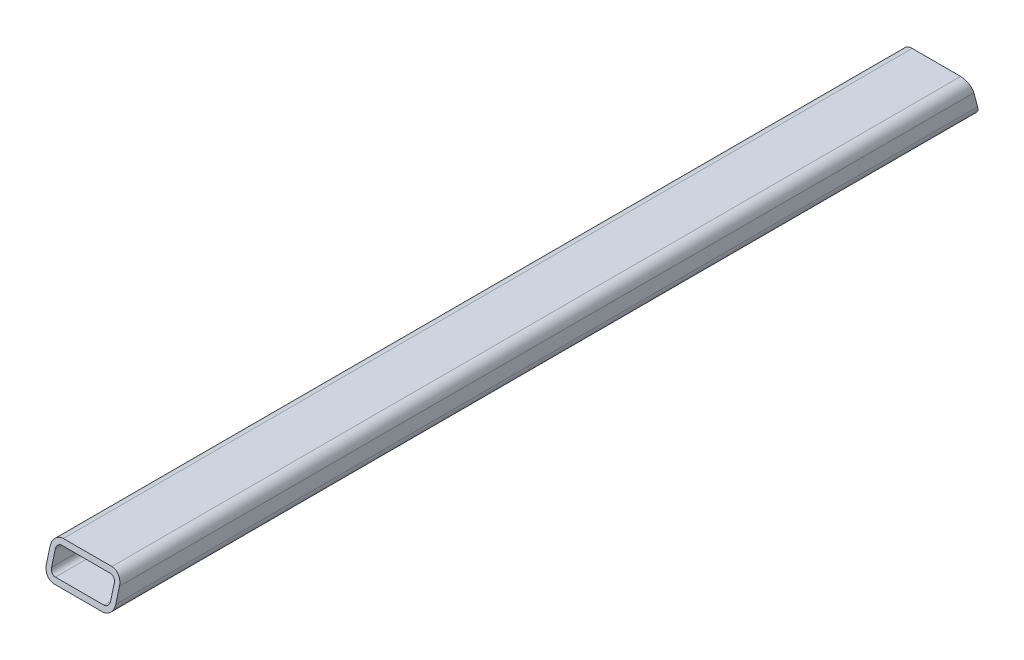
ISO-10303-21;
HEADER;
FILE_DESCRIPTION(('STEP AP214'),'2;1');
FILE_NAME('part.step','',(''),(''),'','','');
FILE_SCHEMA(('AUTOMOTIVE_DESIGN { 1 0 10303 214 1 1 1 1 }'));
ENDSEC;
DATA;
#1=APPLICATION_CONTEXT('core data for automotive mechanical design processes');
#2=APPLICATION_PROTOCOL_DEFINITION('international standard','automotive_design',2000,#1);
#3=PRODUCT_CONTEXT('',#1,'mechanical');
#4=PRODUCT('Part','Part','',(#3));
#5=PRODUCT_RELATED_PRODUCT_CATEGORY('part','',(#4));
#6=PRODUCT_DEFINITION_FORMATION('','',#4);
#7=PRODUCT_DEFINITION_CONTEXT('part definition',#1,'design');
#8=PRODUCT_DEFINITION('design','',#6,#7);
#9=PRODUCT_DEFINITION_SHAPE('','',#8);
#10=(LENGTH_UNIT() NAMED_UNIT(*) SI_UNIT(.MILLI.,.METRE.));
#11=(NAMED_UNIT(*) PLANE_ANGLE_UNIT() SI_UNIT($,.RADIAN.));
#12=(NAMED_UNIT(*) SI_UNIT($,.STERADIAN.) SOLID_ANGLE_UNIT());
#13=UNCERTAINTY_MEASURE_WITH_UNIT(LENGTH_MEASURE(1.E-05),#10,'distance_accuracy_value','');
#14=(GEOMETRIC_REPRESENTATION_CONTEXT(3) GLOBAL_UNCERTAINTY_ASSIGNED_CONTEXT((#13)) GLOBAL_UNIT_ASSIGNED_CONTEXT((#10,
#11,#12)) REPRESENTATION_CONTEXT('',''));
#15=CARTESIAN_POINT('',(0.,0.,0.));
#16=DIRECTION('',(0.,0.,1.));
#17=DIRECTION('',(1.,0.,0.));
#18=AXIS2_PLACEMENT_3D('',#15,#16,#17);
#19=CARTESIAN_POINT('',(14.,-4.,-250.));
#20=DIRECTION('',(0.,0.,1.));
#21=DIRECTION('',(1.,0.,0.));
#22=AXIS2_PLACEMENT_3D('',#19,#20,#21);
#23=CYLINDRICAL_SURFACE('',#22,6.);
#24=DIRECTION('',(0.,0.,1.));
#25=VECTOR('',#24,1.);
#26=CARTESIAN_POINT('',(14.,-10.,-250.));
#27=LINE('',#26,#25);
#28=CARTESIAN_POINT('',(14.,-10.,-250.));
#29=VERTEX_POINT('',#28);
#30=CARTESIAN_POINT('',(14.,-10.,250.));
#31=VERTEX_POINT('',#30);
#32=EDGE_CURVE('E127',#29,#31,#27,.T.);
#33=ORIENTED_EDGE('',*,*,#32,.F.);
#34=CARTESIAN_POINT('',(14.,-4.,-248.392304845413));
#35=DIRECTION('',(0.,0.258819045102518,-0.965925826289069));
#36=DIRECTION('',(0.,0.965925826289069,0.258819045102518));
#37=AXIS2_PLACEMENT_3D('',#34,#35,#36);
#38=ELLIPSE('',#37,6.21165708246049,6.);
#39=CARTESIAN_POINT('',(20.,-3.99999999999996,-248.392304845413));
#40=VERTEX_POINT('',#39);
#41=EDGE_CURVE('E169',#29,#40,#38,.F.);
#42=ORIENTED_EDGE('',*,*,#41,.T.);
#43=DIRECTION('',(0.,0.,1.));
#44=VECTOR('',#43,1.);
#45=CARTESIAN_POINT('',(20.,-3.99999999999996,-250.));
#46=LINE('',#45,#44);
#47=CARTESIAN_POINT('',(20.,-3.99999999999996,248.392304845413));
#48=VERTEX_POINT('',#47);
#49=EDGE_CURVE('E161',#40,#48,#46,.T.);
#50=ORIENTED_EDGE('',*,*,#49,.T.);
#51=CARTESIAN_POINT('',(14.,-4.,248.392304845413));
#52=DIRECTION('',(0.,-0.258819045102519,-0.965925826289069));
#53=DIRECTION('',(0.,-0.965925826289069,0.258819045102519));
#54=AXIS2_PLACEMENT_3D('',#51,#52,#53);
#55=ELLIPSE('',#54,6.21165708246049,6.);
#56=EDGE_CURVE('E171',#48,#31,#55,.T.);
#57=ORIENTED_EDGE('',*,*,#56,.T.);
#58=EDGE_LOOP('',(#33,#42,#50,#57));
#59=FACE_BOUND('',#58,.T.);
#60=ADVANCED_FACE('F43',(#59),#23,.T.);
#61=CARTESIAN_POINT('',(-14.,-10.,-250.));
#62=DIRECTION('',(0.,-1.,0.));
#63=DIRECTION('',(0.,0.,-1.));
#64=AXIS2_PLACEMENT_3D('',#61,#62,#63);
#65=PLANE('',#64);
#66=ORIENTED_EDGE('',*,*,#32,.T.);
#67=DIRECTION('',(1.,0.,0.));
#68=VECTOR('',#67,1.);
#69=CARTESIAN_POINT('',(-14.,-10.,250.));
#70=LINE('',#69,#68);
#71=CARTESIAN_POINT('',(-14.,-10.,250.));
#72=VERTEX_POINT('',#71);
#73=EDGE_CURVE('E177',#72,#31,#70,.T.);
#74=ORIENTED_EDGE('',*,*,#73,.F.);
#75=DIRECTION('',(0.,0.,1.));
#76=VECTOR('',#75,1.);
#77=CARTESIAN_POINT('',(-14.,-10.,-250.));
#78=LINE('',#77,#76);
#79=CARTESIAN_POINT('',(-14.,-10.,-250.));
#80=VERTEX_POINT('',#79);
#81=EDGE_CURVE('E261',#80,#72,#78,.T.);
#82=ORIENTED_EDGE('',*,*,#81,.F.);
#83=DIRECTION('',(1.,0.,0.));
#84=VECTOR('',#83,1.);
#85=CARTESIAN_POINT('',(-14.,-10.,-250.));
#86=LINE('',#85,#84);
#87=EDGE_CURVE('E173',#80,#29,#86,.T.);
#88=ORIENTED_EDGE('',*,*,#87,.T.);
#89=EDGE_LOOP('',(#66,#74,#82,#88));
#90=FACE_BOUND('',#89,.T.);
#91=ADVANCED_FACE('F314',(#90),#65,.T.);
#92=CARTESIAN_POINT('',(-14.,-4.,-250.));
#93=DIRECTION('',(0.,0.,1.));
#94=DIRECTION('',(1.,0.,0.));
#95=AXIS2_PLACEMENT_3D('',#92,#93,#94);
#96=CYLINDRICAL_SURFACE('',#95,6.);
#97=DIRECTION('',(0.,0.,1.));
#98=VECTOR('',#97,1.);
#99=CARTESIAN_POINT('',(-20.,-3.99999999999996,-250.));
#100=LINE('',#99,#98);
#101=CARTESIAN_POINT('',(-20.,-3.99999999999996,-248.392304845413));
#102=VERTEX_POINT('',#101);
#103=CARTESIAN_POINT('',(-20.,-3.99999999999996,248.392304845413));
#104=VERTEX_POINT('',#103);
#105=EDGE_CURVE('E266',#102,#104,#100,.T.);
#106=ORIENTED_EDGE('',*,*,#105,.F.);
#107=CARTESIAN_POINT('',(-14.,-4.,-248.392304845413));
#108=DIRECTION('',(0.,0.258819045102518,-0.965925826289069));
#109=DIRECTION('',(0.,0.965925826289069,0.258819045102518));
#110=AXIS2_PLACEMENT_3D('',#107,#108,#109);
#111=ELLIPSE('',#110,6.21165708246049,6.);
#112=EDGE_CURVE('E179',#102,#80,#111,.F.);
#113=ORIENTED_EDGE('',*,*,#112,.T.);
#114=ORIENTED_EDGE('',*,*,#81,.T.);
#115=CARTESIAN_POINT('',(-14.,-4.,248.392304845413));
#116=DIRECTION('',(0.,-0.258819045102519,-0.965925826289069));
#117=DIRECTION('',(0.,-0.965925826289069,0.258819045102519));
#118=AXIS2_PLACEMENT_3D('',#115,#116,#117);
#119=ELLIPSE('',#118,6.2116570824605,6.);
#120=EDGE_CURVE('E182',#72,#104,#119,.T.);
#121=ORIENTED_EDGE('',*,*,#120,.T.);
#122=EDGE_LOOP('',(#106,#113,#114,#121));
#123=FACE_BOUND('',#122,.T.);
#124=ADVANCED_FACE('F292',(#123),#96,.T.);
#125=CARTESIAN_POINT('',(-20.,3.99999999999996,-250.));
#126=DIRECTION('',(-1.,0.,0.));
#127=DIRECTION('',(0.,0.,1.));
#128=AXIS2_PLACEMENT_3D('',#125,#126,#127);
#129=PLANE('',#128);
#130=DIRECTION('',(0.,0.,1.));
#131=VECTOR('',#130,1.);
#132=CARTESIAN_POINT('',(-20.,3.99999999999996,-250.));
#133=LINE('',#132,#131);
#134=CARTESIAN_POINT('',(-20.,3.99999999999996,-246.248711305964));
#135=VERTEX_POINT('',#134);
#136=CARTESIAN_POINT('',(-20.,3.99999999999996,246.248711305964));
#137=VERTEX_POINT('',#136);
#138=EDGE_CURVE('E267',#135,#137,#133,.T.);
#139=ORIENTED_EDGE('',*,*,#138,.F.);
#140=DIRECTION('',(0.,-0.965925826289069,-0.258819045102518));
#141=VECTOR('',#140,1.);
#142=CARTESIAN_POINT('',(-20.,3.06217782649102,-246.5));
#143=LINE('',#142,#141);
#144=EDGE_CURVE('E288',#135,#102,#143,.T.);
#145=ORIENTED_EDGE('',*,*,#144,.T.);
#146=ORIENTED_EDGE('',*,*,#105,.T.);
#147=DIRECTION('',(0.,-0.965925826289069,0.258819045102519));
#148=VECTOR('',#147,1.);
#149=CARTESIAN_POINT('',(-20.,128.06217782649,213.00635094611));
#150=LINE('',#149,#148);
#151=EDGE_CURVE('E286',#104,#137,#150,.F.);
#152=ORIENTED_EDGE('',*,*,#151,.T.);
#153=EDGE_LOOP('',(#139,#145,#146,#152));
#154=FACE_BOUND('',#153,.T.);
#155=ADVANCED_FACE('F296',(#154),#129,.T.);
#156=CARTESIAN_POINT('',(-14.,4.,-250.));
#157=DIRECTION('',(0.,0.,1.));
#158=DIRECTION('',(1.,0.,0.));
#159=AXIS2_PLACEMENT_3D('',#156,#157,#158);
#160=CYLINDRICAL_SURFACE('',#159,6.);
#161=DIRECTION('',(0.,0.,1.));
#162=VECTOR('',#161,1.);
#163=CARTESIAN_POINT('',(-14.,10.,-250.));
#164=LINE('',#163,#162);
#165=CARTESIAN_POINT('',(-14.,10.,-244.641016151377));
#166=VERTEX_POINT('',#165);
#167=CARTESIAN_POINT('',(-14.,10.,244.641016151377));
#168=VERTEX_POINT('',#167);
#169=EDGE_CURVE('E271',#166,#168,#164,.T.);
#170=ORIENTED_EDGE('',*,*,#169,.F.);
#171=CARTESIAN_POINT('',(-14.,4.,-246.248711305964));
#172=DIRECTION('',(0.,0.258819045102518,-0.965925826289069));
#173=DIRECTION('',(0.,0.965925826289069,0.258819045102518));
#174=AXIS2_PLACEMENT_3D('',#171,#172,#173);
#175=ELLIPSE('',#174,6.21165708246049,6.);
#176=EDGE_CURVE('E283',#166,#135,#175,.F.);
#177=ORIENTED_EDGE('',*,*,#176,.T.);
#178=ORIENTED_EDGE('',*,*,#138,.T.);
#179=CARTESIAN_POINT('',(-14.,4.,246.248711305964));
#180=DIRECTION('',(0.,-0.258819045102519,-0.965925826289069));
#181=DIRECTION('',(0.,-0.965925826289069,0.258819045102519));
#182=AXIS2_PLACEMENT_3D('',#179,#180,#181);
#183=ELLIPSE('',#182,6.21165708246049,6.);
#184=EDGE_CURVE('E285',#137,#168,#183,.T.);
#185=ORIENTED_EDGE('',*,*,#184,.T.);
#186=EDGE_LOOP('',(#170,#177,#178,#185));
#187=FACE_BOUND('',#186,.T.);
#188=ADVANCED_FACE('F302',(#187),#160,.T.);
#189=CARTESIAN_POINT('',(-14.,10.,-250.));
#190=DIRECTION('',(0.,1.,0.));
#191=DIRECTION('',(0.,0.,1.));
#192=AXIS2_PLACEMENT_3D('',#189,#190,#191);
#193=PLANE('',#192);
#194=DIRECTION('',(0.,0.,1.));
#195=VECTOR('',#194,1.);
#196=CARTESIAN_POINT('',(14.,10.,-250.));
#197=LINE('',#196,#195);
#198=CARTESIAN_POINT('',(14.,10.,-244.641016151377));
#199=VERTEX_POINT('',#198);
#200=CARTESIAN_POINT('',(14.,10.,244.641016151377));
#201=VERTEX_POINT('',#200);
#202=EDGE_CURVE('E277',#199,#201,#197,.T.);
#203=ORIENTED_EDGE('',*,*,#202,.F.);
#204=DIRECTION('',(-1.,0.,0.));
#205=VECTOR('',#204,1.);
#206=CARTESIAN_POINT('',(-14.,10.,-244.641016151377));
#207=LINE('',#206,#205);
#208=EDGE_CURVE('E278',#199,#166,#207,.T.);
#209=ORIENTED_EDGE('',*,*,#208,.T.);
#210=ORIENTED_EDGE('',*,*,#169,.T.);
#211=DIRECTION('',(1.,0.,0.));
#212=VECTOR('',#211,1.);
#213=CARTESIAN_POINT('',(-14.,10.,244.641016151377));
#214=LINE('',#213,#212);
#215=EDGE_CURVE('E265',#168,#201,#214,.T.);
#216=ORIENTED_EDGE('',*,*,#215,.T.);
#217=EDGE_LOOP('',(#203,#209,#210,#216));
#218=FACE_BOUND('',#217,.T.);
#219=ADVANCED_FACE('F310',(#218),#193,.T.);
#220=CARTESIAN_POINT('',(14.,4.,-250.));
#221=DIRECTION('',(0.,0.,1.));
#222=DIRECTION('',(1.,0.,0.));
#223=AXIS2_PLACEMENT_3D('',#220,#221,#222);
#224=CYLINDRICAL_SURFACE('',#223,6.);
#225=DIRECTION('',(0.,0.,1.));
#226=VECTOR('',#225,1.);
#227=CARTESIAN_POINT('',(20.,3.99999999999996,-250.));
#228=LINE('',#227,#226);
#229=CARTESIAN_POINT('',(20.,3.99999999999996,-246.248711305964));
#230=VERTEX_POINT('',#229);
#231=CARTESIAN_POINT('',(20.,3.99999999999996,246.248711305964));
#232=VERTEX_POINT('',#231);
#233=EDGE_CURVE('E164',#230,#232,#228,.T.);
#234=ORIENTED_EDGE('',*,*,#233,.F.);
#235=CARTESIAN_POINT('',(14.,4.,-246.248711305964));
#236=DIRECTION('',(0.,0.258819045102518,-0.965925826289069));
#237=DIRECTION('',(0.,0.965925826289069,0.258819045102518));
#238=AXIS2_PLACEMENT_3D('',#235,#236,#237);
#239=ELLIPSE('',#238,6.21165708246049,6.);
#240=EDGE_CURVE('E11',#230,#199,#239,.F.);
#241=ORIENTED_EDGE('',*,*,#240,.T.);
#242=ORIENTED_EDGE('',*,*,#202,.T.);
#243=CARTESIAN_POINT('',(14.,4.,246.248711305964));
#244=DIRECTION('',(0.,-0.258819045102519,-0.965925826289069));
#245=DIRECTION('',(0.,-0.965925826289069,0.258819045102519));
#246=AXIS2_PLACEMENT_3D('',#243,#244,#245);
#247=ELLIPSE('',#246,6.2116570824605,6.);
#248=EDGE_CURVE('E53',#201,#232,#247,.T.);
#249=ORIENTED_EDGE('',*,*,#248,.T.);
#250=EDGE_LOOP('',(#234,#241,#242,#249));
#251=FACE_BOUND('',#250,.T.);
#252=ADVANCED_FACE('F320',(#251),#224,.T.);
#253=CARTESIAN_POINT('',(20.,3.99999999999996,-250.));
#254=DIRECTION('',(1.,0.,0.));
#255=DIRECTION('',(0.,0.,-1.));
#256=AXIS2_PLACEMENT_3D('',#253,#254,#255);
#257=PLANE('',#256);
#258=ORIENTED_EDGE('',*,*,#49,.F.);
#259=DIRECTION('',(0.,0.965925826289069,0.258819045102518));
#260=VECTOR('',#259,1.);
#261=CARTESIAN_POINT('',(20.,3.06217782649102,-246.5));
#262=LINE('',#261,#260);
#263=EDGE_CURVE('E166',#40,#230,#262,.T.);
#264=ORIENTED_EDGE('',*,*,#263,.T.);
#265=ORIENTED_EDGE('',*,*,#233,.T.);
#266=DIRECTION('',(0.,0.965925826289069,-0.258819045102519));
#267=VECTOR('',#266,1.);
#268=CARTESIAN_POINT('',(20.,128.06217782649,213.00635094611));
#269=LINE('',#268,#267);
#270=EDGE_CURVE('E157',#232,#48,#269,.F.);
#271=ORIENTED_EDGE('',*,*,#270,.T.);
#272=EDGE_LOOP('',(#258,#264,#265,#271));
#273=FACE_BOUND('',#272,.T.);
#274=ADVANCED_FACE('F162',(#273),#257,.T.);
#275=CARTESIAN_POINT('',(14.,-4.,-250.));
#276=DIRECTION('',(0.,0.,1.));
#277=DIRECTION('',(1.,0.,0.));
#278=AXIS2_PLACEMENT_3D('',#275,#276,#277);
#279=CYLINDRICAL_SURFACE('',#278,3.);
#280=DIRECTION('',(0.,0.,1.));
#281=VECTOR('',#280,1.);
#282=CARTESIAN_POINT('',(17.,-3.99999999999998,-250.));
#283=LINE('',#282,#281);
#284=CARTESIAN_POINT('',(17.,-3.99999999999998,-248.392304845413));
#285=VERTEX_POINT('',#284);
#286=CARTESIAN_POINT('',(17.,-3.99999999999998,248.392304845413));
#287=VERTEX_POINT('',#286);
#288=EDGE_CURVE('E194',#285,#287,#283,.T.);
#289=ORIENTED_EDGE('',*,*,#288,.F.);
#290=CARTESIAN_POINT('',(14.,-4.,-248.392304845413));
#291=DIRECTION('',(0.,0.258819045102518,-0.965925826289069));
#292=DIRECTION('',(0.,0.965925826289069,0.258819045102518));
#293=AXIS2_PLACEMENT_3D('',#290,#291,#292);
#294=ELLIPSE('',#293,3.10582854123025,3.);
#295=CARTESIAN_POINT('',(14.,-7.,-249.196152422707));
#296=VERTEX_POINT('',#295);
#297=EDGE_CURVE('E212',#296,#285,#294,.F.);
#298=ORIENTED_EDGE('',*,*,#297,.F.);
#299=DIRECTION('',(0.,0.,-1.));
#300=VECTOR('',#299,1.);
#301=CARTESIAN_POINT('',(14.,-7.,-250.));
#302=LINE('',#301,#300);
#303=CARTESIAN_POINT('',(14.,-7.,249.196152422707));
#304=VERTEX_POINT('',#303);
#305=EDGE_CURVE('E238',#296,#304,#302,.F.);
#306=ORIENTED_EDGE('',*,*,#305,.T.);
#307=CARTESIAN_POINT('',(14.,-4.,248.392304845413));
#308=DIRECTION('',(0.,-0.258819045102519,-0.965925826289069));
#309=DIRECTION('',(0.,-0.965925826289069,0.258819045102519));
#310=AXIS2_PLACEMENT_3D('',#307,#308,#309);
#311=ELLIPSE('',#310,3.10582854123025,3.);
#312=EDGE_CURVE('E211',#304,#287,#311,.F.);
#313=ORIENTED_EDGE('',*,*,#312,.T.);
#314=EDGE_LOOP('',(#289,#298,#306,#313));
#315=FACE_BOUND('',#314,.T.);
#316=ADVANCED_FACE('F242',(#315),#279,.F.);
#317=CARTESIAN_POINT('',(-14.,-7.,-250.));
#318=DIRECTION('',(0.,-1.,0.));
#319=DIRECTION('',(0.,0.,-1.));
#320=AXIS2_PLACEMENT_3D('',#317,#318,#319);
#321=PLANE('',#320);
#322=ORIENTED_EDGE('',*,*,#305,.F.);
#323=DIRECTION('',(1.,0.,0.));
#324=VECTOR('',#323,1.);
#325=CARTESIAN_POINT('',(-14.,-7.,-249.196152422707));
#326=LINE('',#325,#324);
#327=CARTESIAN_POINT('',(-14.,-7.,-249.196152422707));
#328=VERTEX_POINT('',#327);
#329=EDGE_CURVE('E186',#328,#296,#326,.T.);
#330=ORIENTED_EDGE('',*,*,#329,.F.);
#331=DIRECTION('',(0.,0.,1.));
#332=VECTOR('',#331,1.);
#333=CARTESIAN_POINT('',(-14.,-7.,-250.));
#334=LINE('',#333,#332);
#335=CARTESIAN_POINT('',(-14.,-7.,249.196152422707));
#336=VERTEX_POINT('',#335);
#337=EDGE_CURVE('E239',#328,#336,#334,.T.);
#338=ORIENTED_EDGE('',*,*,#337,.T.);
#339=DIRECTION('',(-1.,0.,0.));
#340=VECTOR('',#339,1.);
#341=CARTESIAN_POINT('',(14.,-7.,249.196152422707));
#342=LINE('',#341,#340);
#343=EDGE_CURVE('E48',#336,#304,#342,.F.);
#344=ORIENTED_EDGE('',*,*,#343,.T.);
#345=EDGE_LOOP('',(#322,#330,#338,#344));
#346=FACE_BOUND('',#345,.T.);
#347=ADVANCED_FACE('F232',(#346),#321,.F.);
#348=CARTESIAN_POINT('',(-14.,-4.,-250.));
#349=DIRECTION('',(0.,0.,1.));
#350=DIRECTION('',(1.,0.,0.));
#351=AXIS2_PLACEMENT_3D('',#348,#349,#350);
#352=CYLINDRICAL_SURFACE('',#351,3.);
#353=ORIENTED_EDGE('',*,*,#337,.F.);
#354=CARTESIAN_POINT('',(-14.,-4.,-248.392304845413));
#355=DIRECTION('',(0.,0.258819045102518,-0.965925826289069));
#356=DIRECTION('',(0.,0.965925826289069,0.258819045102518));
#357=AXIS2_PLACEMENT_3D('',#354,#355,#356);
#358=ELLIPSE('',#357,3.10582854123025,3.);
#359=CARTESIAN_POINT('',(-17.,-3.99999999999996,-248.392304845413));
#360=VERTEX_POINT('',#359);
#361=EDGE_CURVE('E195',#360,#328,#358,.F.);
#362=ORIENTED_EDGE('',*,*,#361,.F.);
#363=DIRECTION('',(0.,0.,1.));
#364=VECTOR('',#363,1.);
#365=CARTESIAN_POINT('',(-17.,-3.99999999999996,-250.));
#366=LINE('',#365,#364);
#367=CARTESIAN_POINT('',(-17.,-3.99999999999996,248.392304845413));
#368=VERTEX_POINT('',#367);
#369=EDGE_CURVE('E247',#360,#368,#366,.T.);
#370=ORIENTED_EDGE('',*,*,#369,.T.);
#371=CARTESIAN_POINT('',(-14.,-4.,248.392304845413));
#372=DIRECTION('',(0.,-0.258819045102519,-0.965925826289069));
#373=DIRECTION('',(0.,-0.965925826289069,0.258819045102519));
#374=AXIS2_PLACEMENT_3D('',#371,#372,#373);
#375=ELLIPSE('',#374,3.10582854123025,3.);
#376=EDGE_CURVE('E120',#368,#336,#375,.F.);
#377=ORIENTED_EDGE('',*,*,#376,.T.);
#378=EDGE_LOOP('',(#353,#362,#370,#377));
#379=FACE_BOUND('',#378,.T.);
#380=ADVANCED_FACE('F393',(#379),#352,.F.);
#381=CARTESIAN_POINT('',(-17.,3.99999999999996,-250.));
#382=DIRECTION('',(-1.,0.,0.));
#383=DIRECTION('',(0.,0.,1.));
#384=AXIS2_PLACEMENT_3D('',#381,#382,#383);
#385=PLANE('',#384);
#386=ORIENTED_EDGE('',*,*,#369,.F.);
#387=DIRECTION('',(0.,-0.965925826289069,-0.258819045102518));
#388=VECTOR('',#387,1.);
#389=CARTESIAN_POINT('',(-17.,3.06217782649102,-246.5));
#390=LINE('',#389,#388);
#391=CARTESIAN_POINT('',(-17.,3.99999999999998,-246.248711305964));
#392=VERTEX_POINT('',#391);
#393=EDGE_CURVE('E197',#392,#360,#390,.T.);
#394=ORIENTED_EDGE('',*,*,#393,.F.);
#395=DIRECTION('',(0.,0.,1.));
#396=VECTOR('',#395,1.);
#397=CARTESIAN_POINT('',(-17.,3.99999999999998,-250.));
#398=LINE('',#397,#396);
#399=CARTESIAN_POINT('',(-17.,3.99999999999998,246.248711305964));
#400=VERTEX_POINT('',#399);
#401=EDGE_CURVE('E254',#392,#400,#398,.T.);
#402=ORIENTED_EDGE('',*,*,#401,.T.);
#403=DIRECTION('',(0.,0.965925826289069,-0.258819045102519));
#404=VECTOR('',#403,1.);
#405=CARTESIAN_POINT('',(-17.,-10.0000000000005,250.));
#406=LINE('',#405,#404);
#407=EDGE_CURVE('E230',#400,#368,#406,.F.);
#408=ORIENTED_EDGE('',*,*,#407,.T.);
#409=EDGE_LOOP('',(#386,#394,#402,#408));
#410=FACE_BOUND('',#409,.T.);
#411=ADVANCED_FACE('F404',(#410),#385,.F.);
#412=CARTESIAN_POINT('',(-14.,4.,-250.));
#413=DIRECTION('',(0.,0.,1.));
#414=DIRECTION('',(1.,0.,0.));
#415=AXIS2_PLACEMENT_3D('',#412,#413,#414);
#416=CYLINDRICAL_SURFACE('',#415,3.);
#417=ORIENTED_EDGE('',*,*,#401,.F.);
#418=CARTESIAN_POINT('',(-14.,4.,-246.248711305964));
#419=DIRECTION('',(0.,0.258819045102518,-0.965925826289069));
#420=DIRECTION('',(0.,0.965925826289069,0.258819045102518));
#421=AXIS2_PLACEMENT_3D('',#418,#419,#420);
#422=ELLIPSE('',#421,3.10582854123025,3.);
#423=CARTESIAN_POINT('',(-14.,7.,-245.444863728671));
#424=VERTEX_POINT('',#423);
#425=EDGE_CURVE('E196',#424,#392,#422,.F.);
#426=ORIENTED_EDGE('',*,*,#425,.F.);
#427=DIRECTION('',(0.,0.,1.));
#428=VECTOR('',#427,1.);
#429=CARTESIAN_POINT('',(-14.,7.,-250.));
#430=LINE('',#429,#428);
#431=CARTESIAN_POINT('',(-14.,7.,245.444863728671));
#432=VERTEX_POINT('',#431);
#433=EDGE_CURVE('E253',#424,#432,#430,.T.);
#434=ORIENTED_EDGE('',*,*,#433,.T.);
#435=CARTESIAN_POINT('',(-14.,4.,246.248711305964));
#436=DIRECTION('',(0.,-0.258819045102519,-0.965925826289069));
#437=DIRECTION('',(0.,-0.965925826289069,0.258819045102519));
#438=AXIS2_PLACEMENT_3D('',#435,#436,#437);
#439=ELLIPSE('',#438,3.10582854123025,3.);
#440=EDGE_CURVE('E228',#432,#400,#439,.F.);
#441=ORIENTED_EDGE('',*,*,#440,.T.);
#442=EDGE_LOOP('',(#417,#426,#434,#441));
#443=FACE_BOUND('',#442,.T.);
#444=ADVANCED_FACE('F415',(#443),#416,.F.);
#445=CARTESIAN_POINT('',(-14.,7.,-250.));
#446=DIRECTION('',(0.,1.,0.));
#447=DIRECTION('',(0.,0.,1.));
#448=AXIS2_PLACEMENT_3D('',#445,#446,#447);
#449=PLANE('',#448);
#450=ORIENTED_EDGE('',*,*,#433,.F.);
#451=DIRECTION('',(-1.,0.,0.));
#452=VECTOR('',#451,1.);
#453=CARTESIAN_POINT('',(-14.,7.,-245.444863728671));
#454=LINE('',#453,#452);
#455=CARTESIAN_POINT('',(14.,7.,-245.444863728671));
#456=VERTEX_POINT('',#455);
#457=EDGE_CURVE('E201',#456,#424,#454,.T.);
#458=ORIENTED_EDGE('',*,*,#457,.F.);
#459=DIRECTION('',(0.,0.,1.));
#460=VECTOR('',#459,1.);
#461=CARTESIAN_POINT('',(14.,7.,-250.));
#462=LINE('',#461,#460);
#463=CARTESIAN_POINT('',(14.,7.,245.444863728671));
#464=VERTEX_POINT('',#463);
#465=EDGE_CURVE('E259',#456,#464,#462,.T.);
#466=ORIENTED_EDGE('',*,*,#465,.T.);
#467=DIRECTION('',(1.,0.,0.));
#468=VECTOR('',#467,1.);
#469=CARTESIAN_POINT('',(14.,7.,245.444863728671));
#470=LINE('',#469,#468);
#471=EDGE_CURVE('E225',#464,#432,#470,.F.);
#472=ORIENTED_EDGE('',*,*,#471,.T.);
#473=EDGE_LOOP('',(#450,#458,#466,#472));
#474=FACE_BOUND('',#473,.T.);
#475=ADVANCED_FACE('F349',(#474),#449,.F.);
#476=CARTESIAN_POINT('',(14.,4.,-250.));
#477=DIRECTION('',(0.,0.,1.));
#478=DIRECTION('',(1.,0.,0.));
#479=AXIS2_PLACEMENT_3D('',#476,#477,#478);
#480=CYLINDRICAL_SURFACE('',#479,3.);
#481=ORIENTED_EDGE('',*,*,#465,.F.);
#482=CARTESIAN_POINT('',(14.,4.,-246.248711305964));
#483=DIRECTION('',(0.,0.258819045102518,-0.965925826289069));
#484=DIRECTION('',(0.,0.965925826289069,0.258819045102518));
#485=AXIS2_PLACEMENT_3D('',#482,#483,#484);
#486=ELLIPSE('',#485,3.10582854123025,3.);
#487=CARTESIAN_POINT('',(17.,3.99999999999996,-246.248711305964));
#488=VERTEX_POINT('',#487);
#489=EDGE_CURVE('E202',#488,#456,#486,.F.);
#490=ORIENTED_EDGE('',*,*,#489,.F.);
#491=DIRECTION('',(0.,0.,-1.));
#492=VECTOR('',#491,1.);
#493=CARTESIAN_POINT('',(17.,3.99999999999996,-250.));
#494=LINE('',#493,#492);
#495=CARTESIAN_POINT('',(17.,3.99999999999996,246.248711305964));
#496=VERTEX_POINT('',#495);
#497=EDGE_CURVE('E256',#488,#496,#494,.F.);
#498=ORIENTED_EDGE('',*,*,#497,.T.);
#499=CARTESIAN_POINT('',(14.,4.,246.248711305964));
#500=DIRECTION('',(0.,-0.258819045102519,-0.965925826289069));
#501=DIRECTION('',(0.,-0.965925826289069,0.258819045102519));
#502=AXIS2_PLACEMENT_3D('',#499,#500,#501);
#503=ELLIPSE('',#502,3.10582854123025,3.);
#504=EDGE_CURVE('E218',#496,#464,#503,.F.);
#505=ORIENTED_EDGE('',*,*,#504,.T.);
#506=EDGE_LOOP('',(#481,#490,#498,#505));
#507=FACE_BOUND('',#506,.T.);
#508=ADVANCED_FACE('F342',(#507),#480,.F.);
#509=CARTESIAN_POINT('',(17.,3.99999999999996,-250.));
#510=DIRECTION('',(1.,0.,0.));
#511=DIRECTION('',(0.,0.,-1.));
#512=AXIS2_PLACEMENT_3D('',#509,#510,#511);
#513=PLANE('',#512);
#514=ORIENTED_EDGE('',*,*,#497,.F.);
#515=DIRECTION('',(0.,0.965925826289069,0.258819045102518));
#516=VECTOR('',#515,1.);
#517=CARTESIAN_POINT('',(17.,3.06217782649102,-246.5));
#518=LINE('',#517,#516);
#519=EDGE_CURVE('E206',#285,#488,#518,.T.);
#520=ORIENTED_EDGE('',*,*,#519,.F.);
#521=ORIENTED_EDGE('',*,*,#288,.T.);
#522=DIRECTION('',(0.,-0.965925826289069,0.258819045102519));
#523=VECTOR('',#522,1.);
#524=CARTESIAN_POINT('',(17.,-10.0000000000005,250.));
#525=LINE('',#524,#523);
#526=EDGE_CURVE('E219',#287,#496,#525,.F.);
#527=ORIENTED_EDGE('',*,*,#526,.T.);
#528=EDGE_LOOP('',(#514,#520,#521,#527));
#529=FACE_BOUND('',#528,.T.);
#530=ADVANCED_FACE('F337',(#529),#513,.F.);
#531=CARTESIAN_POINT('',(-14.,10.,-244.641016151377));
#532=DIRECTION('',(0.,0.258819045102518,-0.965925826289069));
#533=DIRECTION('',(1.,0.,0.));
#534=AXIS2_PLACEMENT_3D('',#531,#532,#533);
#535=PLANE('',#534);
#536=ORIENTED_EDGE('',*,*,#41,.F.);
#537=ORIENTED_EDGE('',*,*,#87,.F.);
#538=ORIENTED_EDGE('',*,*,#112,.F.);
#539=ORIENTED_EDGE('',*,*,#144,.F.);
#540=ORIENTED_EDGE('',*,*,#176,.F.);
#541=ORIENTED_EDGE('',*,*,#208,.F.);
#542=ORIENTED_EDGE('',*,*,#240,.F.);
#543=ORIENTED_EDGE('',*,*,#263,.F.);
#544=EDGE_LOOP('',(#536,#537,#538,#539,#540,#541,#542,#543));
#545=FACE_BOUND('',#544,.T.);
#546=ORIENTED_EDGE('',*,*,#329,.T.);
#547=ORIENTED_EDGE('',*,*,#297,.T.);
#548=ORIENTED_EDGE('',*,*,#519,.T.);
#549=ORIENTED_EDGE('',*,*,#489,.T.);
#550=ORIENTED_EDGE('',*,*,#457,.T.);
#551=ORIENTED_EDGE('',*,*,#425,.T.);
#552=ORIENTED_EDGE('',*,*,#393,.T.);
#553=ORIENTED_EDGE('',*,*,#361,.T.);
#554=EDGE_LOOP('',(#546,#547,#548,#549,#550,#551,#552,#553));
#555=FACE_BOUND('',#554,.T.);
#556=ADVANCED_FACE('F311',(#545,#555),#535,.T.);
#557=CARTESIAN_POINT('',(14.,-10.0000000000005,250.));
#558=DIRECTION('',(0.,-0.258819045102519,-0.965925826289069));
#559=DIRECTION('',(-1.,0.,0.));
#560=AXIS2_PLACEMENT_3D('',#557,#558,#559);
#561=PLANE('',#560);
#562=ORIENTED_EDGE('',*,*,#248,.F.);
#563=ORIENTED_EDGE('',*,*,#215,.F.);
#564=ORIENTED_EDGE('',*,*,#184,.F.);
#565=ORIENTED_EDGE('',*,*,#151,.F.);
#566=ORIENTED_EDGE('',*,*,#120,.F.);
#567=ORIENTED_EDGE('',*,*,#73,.T.);
#568=ORIENTED_EDGE('',*,*,#56,.F.);
#569=ORIENTED_EDGE('',*,*,#270,.F.);
#570=EDGE_LOOP('',(#562,#563,#564,#565,#566,#567,#568,#569));
#571=FACE_BOUND('',#570,.T.);
#572=ORIENTED_EDGE('',*,*,#312,.F.);
#573=ORIENTED_EDGE('',*,*,#343,.F.);
#574=ORIENTED_EDGE('',*,*,#376,.F.);
#575=ORIENTED_EDGE('',*,*,#407,.F.);
#576=ORIENTED_EDGE('',*,*,#440,.F.);
#577=ORIENTED_EDGE('',*,*,#471,.F.);
#578=ORIENTED_EDGE('',*,*,#504,.F.);
#579=ORIENTED_EDGE('',*,*,#526,.F.);
#580=EDGE_LOOP('',(#572,#573,#574,#575,#576,#577,#578,#579));
#581=FACE_BOUND('',#580,.T.);
#582=ADVANCED_FACE('F46',(#571,#581),#561,.F.);
#583=CLOSED_SHELL('',(#60,#91,#124,#155,#188,#219,#252,#274,#316,#347,#380,#411,#444,#475,#508,
#530,#556,#582));
#584=MANIFOLD_SOLID_BREP('B2',#583);
#585=ADVANCED_BREP_SHAPE_REPRESENTATION('',(#18,#584),#14);
#586=SHAPE_DEFINITION_REPRESENTATION(#9,#585);
ENDSEC;
END-ISO-10303-21;
